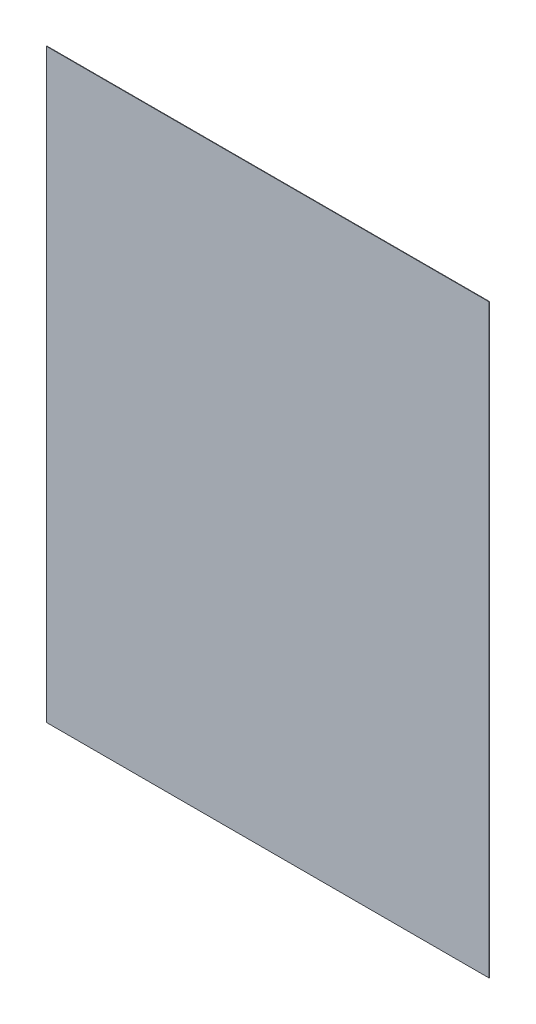
ISO-10303-21;
HEADER;
FILE_DESCRIPTION(('STEP AP214'),'2;1');
FILE_NAME('part.step','',(''),(''),'','','');
FILE_SCHEMA(('AUTOMOTIVE_DESIGN { 1 0 10303 214 1 1 1 1 }'));
ENDSEC;
DATA;
#1=APPLICATION_CONTEXT('core data for automotive mechanical design processes');
#2=APPLICATION_PROTOCOL_DEFINITION('international standard','automotive_design',2000,#1);
#3=PRODUCT_CONTEXT('',#1,'mechanical');
#4=PRODUCT('Part','Part','',(#3));
#5=PRODUCT_RELATED_PRODUCT_CATEGORY('part','',(#4));
#6=PRODUCT_DEFINITION_FORMATION('','',#4);
#7=PRODUCT_DEFINITION_CONTEXT('part definition',#1,'design');
#8=PRODUCT_DEFINITION('design','',#6,#7);
#9=PRODUCT_DEFINITION_SHAPE('','',#8);
#10=(LENGTH_UNIT() NAMED_UNIT(*) SI_UNIT(.MILLI.,.METRE.));
#11=(NAMED_UNIT(*) PLANE_ANGLE_UNIT() SI_UNIT($,.RADIAN.));
#12=(NAMED_UNIT(*) SI_UNIT($,.STERADIAN.) SOLID_ANGLE_UNIT());
#13=UNCERTAINTY_MEASURE_WITH_UNIT(LENGTH_MEASURE(1.E-05),#10,'distance_accuracy_value','');
#14=(GEOMETRIC_REPRESENTATION_CONTEXT(3) GLOBAL_UNCERTAINTY_ASSIGNED_CONTEXT((#13)) GLOBAL_UNIT_ASSIGNED_CONTEXT((#10,
#11,#12)) REPRESENTATION_CONTEXT('',''));
#15=CARTESIAN_POINT('',(0.,0.,0.));
#16=DIRECTION('',(0.,0.,1.));
#17=DIRECTION('',(1.,0.,0.));
#18=AXIS2_PLACEMENT_3D('',#15,#16,#17);
#19=CARTESIAN_POINT('',(1.5,120.,-820.));
#20=DIRECTION('',(-1.,0.,0.));
#21=DIRECTION('',(0.,0.,1.));
#22=AXIS2_PLACEMENT_3D('',#19,#20,#21);
#23=PLANE('',#22);
#24=DIRECTION('',(0.,-1.,0.));
#25=VECTOR('',#24,1.);
#26=CARTESIAN_POINT('',(1.5,120.,-818.5));
#27=LINE('',#26,#25);
#28=CARTESIAN_POINT('',(1.5,1968.5,-818.5));
#29=VERTEX_POINT('',#28);
#30=CARTESIAN_POINT('',(1.5,120.,-818.5));
#31=VERTEX_POINT('',#30);
#32=EDGE_CURVE('E103',#29,#31,#27,.T.);
#33=ORIENTED_EDGE('',*,*,#32,.F.);
#34=DIRECTION('',(0.,0.,1.));
#35=VECTOR('',#34,1.);
#36=CARTESIAN_POINT('',(1.5,1968.5,-820.));
#37=LINE('',#36,#35);
#38=CARTESIAN_POINT('',(1.5,1968.5,-820.));
#39=VERTEX_POINT('',#38);
#40=EDGE_CURVE('E11',#39,#29,#37,.T.);
#41=ORIENTED_EDGE('',*,*,#40,.F.);
#42=DIRECTION('',(0.,-1.,0.));
#43=VECTOR('',#42,1.);
#44=CARTESIAN_POINT('',(1.5,120.,-820.));
#45=LINE('',#44,#43);
#46=CARTESIAN_POINT('',(1.5,120.,-820.));
#47=VERTEX_POINT('',#46);
#48=EDGE_CURVE('E97',#39,#47,#45,.T.);
#49=ORIENTED_EDGE('',*,*,#48,.T.);
#50=DIRECTION('',(0.,0.,1.));
#51=VECTOR('',#50,1.);
#52=CARTESIAN_POINT('',(1.5,120.,-820.));
#53=LINE('',#52,#51);
#54=EDGE_CURVE('E42',#47,#31,#53,.T.);
#55=ORIENTED_EDGE('',*,*,#54,.T.);
#56=EDGE_LOOP('',(#33,#41,#49,#55));
#57=FACE_BOUND('',#56,.T.);
#58=ADVANCED_FACE('F39',(#57),#23,.T.);
#59=CARTESIAN_POINT('',(1.5,1968.5,-820.));
#60=DIRECTION('',(0.,1.,0.));
#61=DIRECTION('',(0.,0.,1.));
#62=AXIS2_PLACEMENT_3D('',#59,#60,#61);
#63=PLANE('',#62);
#64=DIRECTION('',(-1.,0.,0.));
#65=VECTOR('',#64,1.);
#66=CARTESIAN_POINT('',(1.5,1968.5,-818.5));
#67=LINE('',#66,#65);
#68=CARTESIAN_POINT('',(1398.5,1968.5,-818.5));
#69=VERTEX_POINT('',#68);
#70=EDGE_CURVE('E99',#69,#29,#67,.T.);
#71=ORIENTED_EDGE('',*,*,#70,.F.);
#72=DIRECTION('',(0.,0.,1.));
#73=VECTOR('',#72,1.);
#74=CARTESIAN_POINT('',(1398.5,1968.5,-820.));
#75=LINE('',#74,#73);
#76=CARTESIAN_POINT('',(1398.5,1968.5,-820.));
#77=VERTEX_POINT('',#76);
#78=EDGE_CURVE('E48',#77,#69,#75,.T.);
#79=ORIENTED_EDGE('',*,*,#78,.F.);
#80=DIRECTION('',(-1.,0.,0.));
#81=VECTOR('',#80,1.);
#82=CARTESIAN_POINT('',(1.5,1968.5,-820.));
#83=LINE('',#82,#81);
#84=EDGE_CURVE('E94',#77,#39,#83,.T.);
#85=ORIENTED_EDGE('',*,*,#84,.T.);
#86=ORIENTED_EDGE('',*,*,#40,.T.);
#87=EDGE_LOOP('',(#71,#79,#85,#86));
#88=FACE_BOUND('',#87,.T.);
#89=ADVANCED_FACE('F113',(#88),#63,.T.);
#90=CARTESIAN_POINT('',(1398.5,120.,-820.));
#91=DIRECTION('',(1.,0.,0.));
#92=DIRECTION('',(0.,0.,-1.));
#93=AXIS2_PLACEMENT_3D('',#90,#91,#92);
#94=PLANE('',#93);
#95=DIRECTION('',(0.,1.,0.));
#96=VECTOR('',#95,1.);
#97=CARTESIAN_POINT('',(1398.5,120.,-818.5));
#98=LINE('',#97,#96);
#99=CARTESIAN_POINT('',(1398.5,120.,-818.5));
#100=VERTEX_POINT('',#99);
#101=EDGE_CURVE('E89',#100,#69,#98,.T.);
#102=ORIENTED_EDGE('',*,*,#101,.F.);
#103=DIRECTION('',(0.,0.,1.));
#104=VECTOR('',#103,1.);
#105=CARTESIAN_POINT('',(1398.5,120.,-820.));
#106=LINE('',#105,#104);
#107=CARTESIAN_POINT('',(1398.5,120.,-820.));
#108=VERTEX_POINT('',#107);
#109=EDGE_CURVE('E84',#108,#100,#106,.T.);
#110=ORIENTED_EDGE('',*,*,#109,.F.);
#111=DIRECTION('',(0.,1.,0.));
#112=VECTOR('',#111,1.);
#113=CARTESIAN_POINT('',(1398.5,120.,-820.));
#114=LINE('',#113,#112);
#115=EDGE_CURVE('E87',#108,#77,#114,.T.);
#116=ORIENTED_EDGE('',*,*,#115,.T.);
#117=ORIENTED_EDGE('',*,*,#78,.T.);
#118=EDGE_LOOP('',(#102,#110,#116,#117));
#119=FACE_BOUND('',#118,.T.);
#120=ADVANCED_FACE('F86',(#119),#94,.T.);
#121=CARTESIAN_POINT('',(1.5,120.,-820.));
#122=DIRECTION('',(0.,-1.,0.));
#123=DIRECTION('',(0.,0.,-1.));
#124=AXIS2_PLACEMENT_3D('',#121,#122,#123);
#125=PLANE('',#124);
#126=DIRECTION('',(1.,0.,0.));
#127=VECTOR('',#126,1.);
#128=CARTESIAN_POINT('',(1.5,120.,-818.5));
#129=LINE('',#128,#127);
#130=EDGE_CURVE('E106',#31,#100,#129,.T.);
#131=ORIENTED_EDGE('',*,*,#130,.F.);
#132=ORIENTED_EDGE('',*,*,#54,.F.);
#133=DIRECTION('',(1.,0.,0.));
#134=VECTOR('',#133,1.);
#135=CARTESIAN_POINT('',(1.5,120.,-820.));
#136=LINE('',#135,#134);
#137=EDGE_CURVE('E93',#47,#108,#136,.T.);
#138=ORIENTED_EDGE('',*,*,#137,.T.);
#139=ORIENTED_EDGE('',*,*,#109,.T.);
#140=EDGE_LOOP('',(#131,#132,#138,#139));
#141=FACE_BOUND('',#140,.T.);
#142=ADVANCED_FACE('F96',(#141),#125,.T.);
#143=CARTESIAN_POINT('',(0.,0.,-820.));
#144=DIRECTION('',(0.,0.,-1.));
#145=DIRECTION('',(-1.,0.,0.));
#146=AXIS2_PLACEMENT_3D('',#143,#144,#145);
#147=PLANE('',#146);
#148=ORIENTED_EDGE('',*,*,#48,.F.);
#149=ORIENTED_EDGE('',*,*,#84,.F.);
#150=ORIENTED_EDGE('',*,*,#115,.F.);
#151=ORIENTED_EDGE('',*,*,#137,.F.);
#152=EDGE_LOOP('',(#148,#149,#150,#151));
#153=FACE_BOUND('',#152,.T.);
#154=ADVANCED_FACE('F92',(#153),#147,.T.);
#155=CARTESIAN_POINT('',(0.,0.,-818.5));
#156=DIRECTION('',(0.,0.,-1.));
#157=DIRECTION('',(-1.,0.,0.));
#158=AXIS2_PLACEMENT_3D('',#155,#156,#157);
#159=PLANE('',#158);
#160=ORIENTED_EDGE('',*,*,#32,.T.);
#161=ORIENTED_EDGE('',*,*,#130,.T.);
#162=ORIENTED_EDGE('',*,*,#101,.T.);
#163=ORIENTED_EDGE('',*,*,#70,.T.);
#164=EDGE_LOOP('',(#160,#161,#162,#163));
#165=FACE_BOUND('',#164,.T.);
#166=ADVANCED_FACE('F112',(#165),#159,.F.);
#167=CLOSED_SHELL('',(#58,#89,#120,#142,#154,#166));
#168=MANIFOLD_SOLID_BREP('B2',#167);
#169=ADVANCED_BREP_SHAPE_REPRESENTATION('',(#18,#168),#14);
#170=SHAPE_DEFINITION_REPRESENTATION(#9,#169);
ENDSEC;
END-ISO-10303-21;
